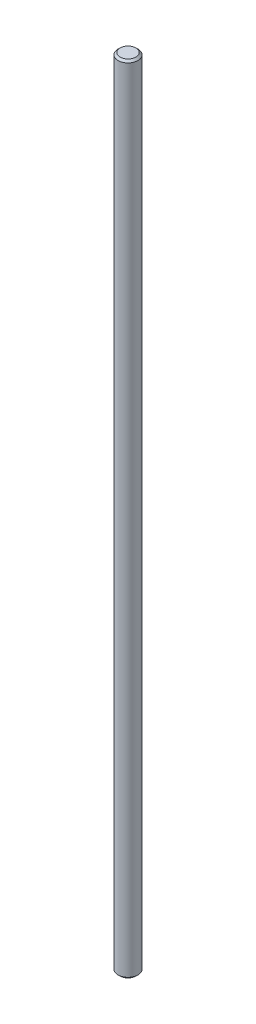
ISO-10303-21;
HEADER;
FILE_DESCRIPTION(('STEP AP214'),'2;1');
FILE_NAME('part.step','',(''),(''),'','','');
FILE_SCHEMA(('AUTOMOTIVE_DESIGN { 1 0 10303 214 1 1 1 1 }'));
ENDSEC;
DATA;
#1=APPLICATION_CONTEXT('core data for automotive mechanical design processes');
#2=APPLICATION_PROTOCOL_DEFINITION('international standard','automotive_design',2000,#1);
#3=PRODUCT_CONTEXT('',#1,'mechanical');
#4=PRODUCT('Part','Part','',(#3));
#5=PRODUCT_RELATED_PRODUCT_CATEGORY('part','',(#4));
#6=PRODUCT_DEFINITION_FORMATION('','',#4);
#7=PRODUCT_DEFINITION_CONTEXT('part definition',#1,'design');
#8=PRODUCT_DEFINITION('design','',#6,#7);
#9=PRODUCT_DEFINITION_SHAPE('','',#8);
#10=(LENGTH_UNIT() NAMED_UNIT(*) SI_UNIT(.MILLI.,.METRE.));
#11=(NAMED_UNIT(*) PLANE_ANGLE_UNIT() SI_UNIT($,.RADIAN.));
#12=(NAMED_UNIT(*) SI_UNIT($,.STERADIAN.) SOLID_ANGLE_UNIT());
#13=UNCERTAINTY_MEASURE_WITH_UNIT(LENGTH_MEASURE(1.E-05),#10,'distance_accuracy_value','');
#14=(GEOMETRIC_REPRESENTATION_CONTEXT(3) GLOBAL_UNCERTAINTY_ASSIGNED_CONTEXT((#13)) GLOBAL_UNIT_ASSIGNED_CONTEXT((#10,
#11,#12)) REPRESENTATION_CONTEXT('',''));
#15=CARTESIAN_POINT('',(0.,0.,0.));
#16=DIRECTION('',(0.,0.,1.));
#17=DIRECTION('',(1.,0.,0.));
#18=AXIS2_PLACEMENT_3D('',#15,#16,#17);
#19=CARTESIAN_POINT('',(0.,400.,0.));
#20=DIRECTION('',(0.,-1.,0.));
#21=DIRECTION('',(0.,0.,-1.));
#22=AXIS2_PLACEMENT_3D('',#19,#20,#21);
#23=CYLINDRICAL_SURFACE('',#22,5.);
#24=CARTESIAN_POINT('',(0.,1.,0.));
#25=DIRECTION('',(0.,1.,0.));
#26=DIRECTION('',(0.,0.,1.));
#27=AXIS2_PLACEMENT_3D('',#24,#25,#26);
#28=CIRCLE('',#27,5.);
#29=CARTESIAN_POINT('',(0.,1.,5.));
#30=VERTEX_POINT('',#29);
#31=EDGE_CURVE('E53',#30,#30,#28,.T.);
#32=ORIENTED_EDGE('',*,*,#31,.T.);
#33=EDGE_LOOP('',(#32));
#34=FACE_BOUND('',#33,.T.);
#35=CARTESIAN_POINT('',(0.,399.,0.));
#36=DIRECTION('',(0.,1.,0.));
#37=DIRECTION('',(0.,0.,1.));
#38=AXIS2_PLACEMENT_3D('',#35,#36,#37);
#39=CIRCLE('',#38,5.);
#40=CARTESIAN_POINT('',(0.,399.,5.));
#41=VERTEX_POINT('',#40);
#42=EDGE_CURVE('E58',#41,#41,#39,.F.);
#43=ORIENTED_EDGE('',*,*,#42,.T.);
#44=EDGE_LOOP('',(#43));
#45=FACE_BOUND('',#44,.T.);
#46=ADVANCED_FACE('F39',(#34,#45),#23,.T.);
#47=CARTESIAN_POINT('',(0.,400.,0.));
#48=DIRECTION('',(0.,1.,0.));
#49=DIRECTION('',(0.,0.,1.));
#50=AXIS2_PLACEMENT_3D('',#47,#48,#49);
#51=PLANE('',#50);
#52=CARTESIAN_POINT('',(0.,400.,0.));
#53=DIRECTION('',(0.,1.,0.));
#54=DIRECTION('',(0.,0.,1.));
#55=AXIS2_PLACEMENT_3D('',#52,#53,#54);
#56=CIRCLE('',#55,4.00000000000006);
#57=CARTESIAN_POINT('',(0.,400.,4.00000000000006));
#58=VERTEX_POINT('',#57);
#59=EDGE_CURVE('E10',#58,#58,#56,.T.);
#60=ORIENTED_EDGE('',*,*,#59,.T.);
#61=EDGE_LOOP('',(#60));
#62=FACE_BOUND('',#61,.T.);
#63=ADVANCED_FACE('F75',(#62),#51,.T.);
#64=CARTESIAN_POINT('',(0.,0.,0.));
#65=DIRECTION('',(0.,1.,0.));
#66=DIRECTION('',(0.,0.,1.));
#67=AXIS2_PLACEMENT_3D('',#64,#65,#66);
#68=PLANE('',#67);
#69=CARTESIAN_POINT('',(0.,0.,0.));
#70=DIRECTION('',(0.,1.,0.));
#71=DIRECTION('',(0.,0.,1.));
#72=AXIS2_PLACEMENT_3D('',#69,#70,#71);
#73=CIRCLE('',#72,4.);
#74=CARTESIAN_POINT('',(0.,0.,4.));
#75=VERTEX_POINT('',#74);
#76=EDGE_CURVE('E48',#75,#75,#73,.F.);
#77=ORIENTED_EDGE('',*,*,#76,.T.);
#78=EDGE_LOOP('',(#77));
#79=FACE_BOUND('',#78,.T.);
#80=ADVANCED_FACE('F72',(#79),#68,.F.);
#81=CARTESIAN_POINT('',(0.,1.,0.));
#82=DIRECTION('',(0.,1.,0.));
#83=DIRECTION('',(0.,0.,1.));
#84=AXIS2_PLACEMENT_3D('',#81,#82,#83);
#85=CONICAL_SURFACE('',#84,5.,0.785398163397446);
#86=ORIENTED_EDGE('',*,*,#76,.F.);
#87=EDGE_LOOP('',(#86));
#88=FACE_BOUND('',#87,.T.);
#89=ORIENTED_EDGE('',*,*,#31,.F.);
#90=EDGE_LOOP('',(#89));
#91=FACE_BOUND('',#90,.T.);
#92=ADVANCED_FACE('F68',(#88,#91),#85,.T.);
#93=CARTESIAN_POINT('',(0.,400.,0.));
#94=DIRECTION('',(0.,-1.,0.));
#95=DIRECTION('',(0.,0.,-1.));
#96=AXIS2_PLACEMENT_3D('',#93,#94,#95);
#97=CONICAL_SURFACE('',#96,4.00000000000006,0.785398163397446);
#98=ORIENTED_EDGE('',*,*,#42,.F.);
#99=EDGE_LOOP('',(#98));
#100=FACE_BOUND('',#99,.T.);
#101=ORIENTED_EDGE('',*,*,#59,.F.);
#102=EDGE_LOOP('',(#101));
#103=FACE_BOUND('',#102,.T.);
#104=ADVANCED_FACE('F42',(#100,#103),#97,.T.);
#105=CLOSED_SHELL('',(#46,#63,#80,#92,#104));
#106=MANIFOLD_SOLID_BREP('B2',#105);
#107=ADVANCED_BREP_SHAPE_REPRESENTATION('',(#18,#106),#14);
#108=SHAPE_DEFINITION_REPRESENTATION(#9,#107);
ENDSEC;
END-ISO-10303-21;
